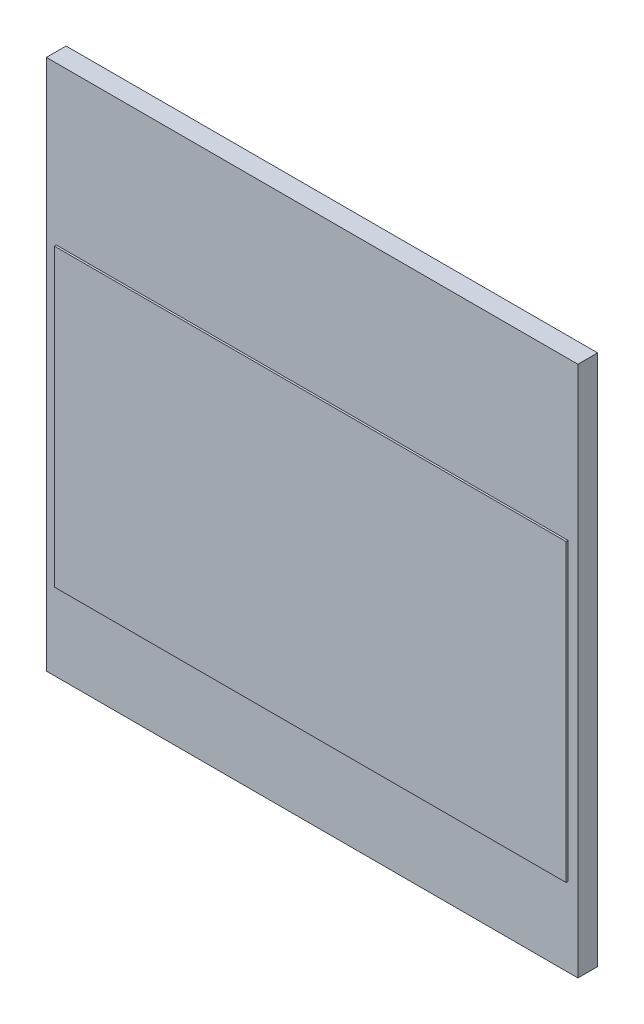
ISO-10303-21;
HEADER;
FILE_DESCRIPTION(('STEP AP214'),'2;1');
FILE_NAME('part.step','',(''),(''),'','','');
FILE_SCHEMA(('AUTOMOTIVE_DESIGN { 1 0 10303 214 1 1 1 1 }'));
ENDSEC;
DATA;
#1=APPLICATION_CONTEXT('core data for automotive mechanical design processes');
#2=APPLICATION_PROTOCOL_DEFINITION('international standard','automotive_design',2000,#1);
#3=PRODUCT_CONTEXT('',#1,'mechanical');
#4=PRODUCT('Part','Part','',(#3));
#5=PRODUCT_RELATED_PRODUCT_CATEGORY('part','',(#4));
#6=PRODUCT_DEFINITION_FORMATION('','',#4);
#7=PRODUCT_DEFINITION_CONTEXT('part definition',#1,'design');
#8=PRODUCT_DEFINITION('design','',#6,#7);
#9=PRODUCT_DEFINITION_SHAPE('','',#8);
#10=(LENGTH_UNIT() NAMED_UNIT(*) SI_UNIT(.MILLI.,.METRE.));
#11=(NAMED_UNIT(*) PLANE_ANGLE_UNIT() SI_UNIT($,.RADIAN.));
#12=(NAMED_UNIT(*) SI_UNIT($,.STERADIAN.) SOLID_ANGLE_UNIT());
#13=UNCERTAINTY_MEASURE_WITH_UNIT(LENGTH_MEASURE(1.E-05),#10,'distance_accuracy_value','');
#14=(GEOMETRIC_REPRESENTATION_CONTEXT(3) GLOBAL_UNCERTAINTY_ASSIGNED_CONTEXT((#13)) GLOBAL_UNIT_ASSIGNED_CONTEXT((#10,
#11,#12)) REPRESENTATION_CONTEXT('',''));
#15=CARTESIAN_POINT('',(0.,0.,0.));
#16=DIRECTION('',(0.,0.,1.));
#17=DIRECTION('',(1.,0.,0.));
#18=AXIS2_PLACEMENT_3D('',#15,#16,#17);
#19=CARTESIAN_POINT('',(13.,-7.5,0.1));
#20=DIRECTION('',(-1.,0.,0.));
#21=DIRECTION('',(0.,0.,1.));
#22=AXIS2_PLACEMENT_3D('',#19,#20,#21);
#23=PLANE('',#22);
#24=DIRECTION('',(0.,1.,0.));
#25=VECTOR('',#24,1.);
#26=CARTESIAN_POINT('',(13.,-7.5,0.));
#27=LINE('',#26,#25);
#28=CARTESIAN_POINT('',(13.,-7.5,0.));
#29=VERTEX_POINT('',#28);
#30=CARTESIAN_POINT('',(13.,7.5,0.));
#31=VERTEX_POINT('',#30);
#32=EDGE_CURVE('E117',#29,#31,#27,.T.);
#33=ORIENTED_EDGE('',*,*,#32,.T.);
#34=DIRECTION('',(0.,0.,-1.));
#35=VECTOR('',#34,1.);
#36=CARTESIAN_POINT('',(13.,7.5,0.1));
#37=LINE('',#36,#35);
#38=CARTESIAN_POINT('',(13.,7.5,0.1));
#39=VERTEX_POINT('',#38);
#40=EDGE_CURVE('E11',#39,#31,#37,.T.);
#41=ORIENTED_EDGE('',*,*,#40,.F.);
#42=DIRECTION('',(0.,1.,0.));
#43=VECTOR('',#42,1.);
#44=CARTESIAN_POINT('',(13.,-7.5,0.1));
#45=LINE('',#44,#43);
#46=CARTESIAN_POINT('',(13.,-7.5,0.1));
#47=VERTEX_POINT('',#46);
#48=EDGE_CURVE('E126',#47,#39,#45,.T.);
#49=ORIENTED_EDGE('',*,*,#48,.F.);
#50=DIRECTION('',(0.,0.,-1.));
#51=VECTOR('',#50,1.);
#52=CARTESIAN_POINT('',(13.,-7.5,0.1));
#53=LINE('',#52,#51);
#54=EDGE_CURVE('E133',#47,#29,#53,.T.);
#55=ORIENTED_EDGE('',*,*,#54,.T.);
#56=EDGE_LOOP('',(#33,#41,#49,#55));
#57=FACE_BOUND('',#56,.T.);
#58=ADVANCED_FACE('F32',(#57),#23,.F.);
#59=CARTESIAN_POINT('',(-13.,7.5,0.1));
#60=DIRECTION('',(0.,-1.,0.));
#61=DIRECTION('',(0.,0.,-1.));
#62=AXIS2_PLACEMENT_3D('',#59,#60,#61);
#63=PLANE('',#62);
#64=DIRECTION('',(-1.,0.,0.));
#65=VECTOR('',#64,1.);
#66=CARTESIAN_POINT('',(-13.,7.5,0.));
#67=LINE('',#66,#65);
#68=CARTESIAN_POINT('',(-13.,7.5,0.));
#69=VERTEX_POINT('',#68);
#70=EDGE_CURVE('E120',#31,#69,#67,.T.);
#71=ORIENTED_EDGE('',*,*,#70,.T.);
#72=DIRECTION('',(0.,0.,-1.));
#73=VECTOR('',#72,1.);
#74=CARTESIAN_POINT('',(-13.,7.5,0.1));
#75=LINE('',#74,#73);
#76=CARTESIAN_POINT('',(-13.,7.5,0.1));
#77=VERTEX_POINT('',#76);
#78=EDGE_CURVE('E40',#77,#69,#75,.T.);
#79=ORIENTED_EDGE('',*,*,#78,.F.);
#80=DIRECTION('',(-1.,0.,0.));
#81=VECTOR('',#80,1.);
#82=CARTESIAN_POINT('',(-13.,7.5,0.1));
#83=LINE('',#82,#81);
#84=EDGE_CURVE('E128',#39,#77,#83,.T.);
#85=ORIENTED_EDGE('',*,*,#84,.F.);
#86=ORIENTED_EDGE('',*,*,#40,.T.);
#87=EDGE_LOOP('',(#71,#79,#85,#86));
#88=FACE_BOUND('',#87,.T.);
#89=ADVANCED_FACE('F154',(#88),#63,.F.);
#90=CARTESIAN_POINT('',(-13.,-7.5,0.1));
#91=DIRECTION('',(1.,0.,0.));
#92=DIRECTION('',(0.,0.,-1.));
#93=AXIS2_PLACEMENT_3D('',#90,#91,#92);
#94=PLANE('',#93);
#95=DIRECTION('',(0.,-1.,0.));
#96=VECTOR('',#95,1.);
#97=CARTESIAN_POINT('',(-13.,-7.5,0.));
#98=LINE('',#97,#96);
#99=CARTESIAN_POINT('',(-13.,-7.5,0.));
#100=VERTEX_POINT('',#99);
#101=EDGE_CURVE('E137',#69,#100,#98,.T.);
#102=ORIENTED_EDGE('',*,*,#101,.T.);
#103=DIRECTION('',(0.,0.,-1.));
#104=VECTOR('',#103,1.);
#105=CARTESIAN_POINT('',(-13.,-7.5,0.1));
#106=LINE('',#105,#104);
#107=CARTESIAN_POINT('',(-13.,-7.5,0.1));
#108=VERTEX_POINT('',#107);
#109=EDGE_CURVE('E144',#108,#100,#106,.T.);
#110=ORIENTED_EDGE('',*,*,#109,.F.);
#111=DIRECTION('',(0.,-1.,0.));
#112=VECTOR('',#111,1.);
#113=CARTESIAN_POINT('',(-13.,-7.5,0.1));
#114=LINE('',#113,#112);
#115=EDGE_CURVE('E131',#77,#108,#114,.T.);
#116=ORIENTED_EDGE('',*,*,#115,.F.);
#117=ORIENTED_EDGE('',*,*,#78,.T.);
#118=EDGE_LOOP('',(#102,#110,#116,#117));
#119=FACE_BOUND('',#118,.T.);
#120=ADVANCED_FACE('F150',(#119),#94,.F.);
#121=CARTESIAN_POINT('',(-13.,-7.5,0.1));
#122=DIRECTION('',(0.,1.,0.));
#123=DIRECTION('',(0.,0.,1.));
#124=AXIS2_PLACEMENT_3D('',#121,#122,#123);
#125=PLANE('',#124);
#126=DIRECTION('',(1.,0.,0.));
#127=VECTOR('',#126,1.);
#128=CARTESIAN_POINT('',(-13.,-7.5,0.));
#129=LINE('',#128,#127);
#130=EDGE_CURVE('E129',#100,#29,#129,.T.);
#131=ORIENTED_EDGE('',*,*,#130,.T.);
#132=ORIENTED_EDGE('',*,*,#54,.F.);
#133=DIRECTION('',(1.,0.,0.));
#134=VECTOR('',#133,1.);
#135=CARTESIAN_POINT('',(-13.,-7.5,0.1));
#136=LINE('',#135,#134);
#137=EDGE_CURVE('E47',#108,#47,#136,.T.);
#138=ORIENTED_EDGE('',*,*,#137,.F.);
#139=ORIENTED_EDGE('',*,*,#109,.T.);
#140=EDGE_LOOP('',(#131,#132,#138,#139));
#141=FACE_BOUND('',#140,.T.);
#142=ADVANCED_FACE('F159',(#141),#125,.F.);
#143=CARTESIAN_POINT('',(0.,0.,0.1));
#144=DIRECTION('',(0.,0.,-1.));
#145=DIRECTION('',(-1.,0.,0.));
#146=AXIS2_PLACEMENT_3D('',#143,#144,#145);
#147=PLANE('',#146);
#148=ORIENTED_EDGE('',*,*,#48,.T.);
#149=ORIENTED_EDGE('',*,*,#84,.T.);
#150=ORIENTED_EDGE('',*,*,#115,.T.);
#151=ORIENTED_EDGE('',*,*,#137,.T.);
#152=EDGE_LOOP('',(#148,#149,#150,#151));
#153=FACE_BOUND('',#152,.T.);
#154=ADVANCED_FACE('F162',(#153),#147,.F.);
#155=CARTESIAN_POINT('',(0.,0.,0.));
#156=DIRECTION('',(0.,0.,1.));
#157=DIRECTION('',(1.,0.,0.));
#158=AXIS2_PLACEMENT_3D('',#155,#156,#157);
#159=PLANE('',#158);
#160=DIRECTION('',(0.,1.,0.));
#161=VECTOR('',#160,1.);
#162=CARTESIAN_POINT('',(-13.5,-11.5,0.));
#163=LINE('',#162,#161);
#164=CARTESIAN_POINT('',(-13.5,-11.5,0.));
#165=VERTEX_POINT('',#164);
#166=CARTESIAN_POINT('',(-13.5,15.5,0.));
#167=VERTEX_POINT('',#166);
#168=EDGE_CURVE('E116',#165,#167,#163,.T.);
#169=ORIENTED_EDGE('',*,*,#168,.F.);
#170=DIRECTION('',(-1.,0.,0.));
#171=VECTOR('',#170,1.);
#172=CARTESIAN_POINT('',(13.5,-11.5,0.));
#173=LINE('',#172,#171);
#174=CARTESIAN_POINT('',(13.5,-11.5,0.));
#175=VERTEX_POINT('',#174);
#176=EDGE_CURVE('E112',#175,#165,#173,.T.);
#177=ORIENTED_EDGE('',*,*,#176,.F.);
#178=DIRECTION('',(0.,-1.,0.));
#179=VECTOR('',#178,1.);
#180=CARTESIAN_POINT('',(13.5,-11.5,0.));
#181=LINE('',#180,#179);
#182=CARTESIAN_POINT('',(13.5,15.5,0.));
#183=VERTEX_POINT('',#182);
#184=EDGE_CURVE('E246',#183,#175,#181,.T.);
#185=ORIENTED_EDGE('',*,*,#184,.F.);
#186=DIRECTION('',(1.,0.,0.));
#187=VECTOR('',#186,1.);
#188=CARTESIAN_POINT('',(13.5,15.5,0.));
#189=LINE('',#188,#187);
#190=EDGE_CURVE('E249',#167,#183,#189,.T.);
#191=ORIENTED_EDGE('',*,*,#190,.F.);
#192=EDGE_LOOP('',(#169,#177,#185,#191));
#193=FACE_BOUND('',#192,.T.);
#194=ORIENTED_EDGE('',*,*,#32,.F.);
#195=ORIENTED_EDGE('',*,*,#130,.F.);
#196=ORIENTED_EDGE('',*,*,#101,.F.);
#197=ORIENTED_EDGE('',*,*,#70,.F.);
#198=EDGE_LOOP('',(#194,#195,#196,#197));
#199=FACE_BOUND('',#198,.T.);
#200=ADVANCED_FACE('F157',(#193,#199),#159,.T.);
#201=CARTESIAN_POINT('',(-13.5,-11.5,-1.));
#202=DIRECTION('',(1.,0.,0.));
#203=DIRECTION('',(0.,0.,-1.));
#204=AXIS2_PLACEMENT_3D('',#201,#202,#203);
#205=PLANE('',#204);
#206=ORIENTED_EDGE('',*,*,#168,.T.);
#207=DIRECTION('',(0.,0.,1.));
#208=VECTOR('',#207,1.);
#209=CARTESIAN_POINT('',(-13.5,15.5,-1.));
#210=LINE('',#209,#208);
#211=CARTESIAN_POINT('',(-13.5,15.5,-1.));
#212=VERTEX_POINT('',#211);
#213=EDGE_CURVE('E96',#212,#167,#210,.T.);
#214=ORIENTED_EDGE('',*,*,#213,.F.);
#215=DIRECTION('',(0.,1.,0.));
#216=VECTOR('',#215,1.);
#217=CARTESIAN_POINT('',(-13.5,-11.5,-1.));
#218=LINE('',#217,#216);
#219=CARTESIAN_POINT('',(-13.5,-11.5,-1.));
#220=VERTEX_POINT('',#219);
#221=EDGE_CURVE('E103',#220,#212,#218,.T.);
#222=ORIENTED_EDGE('',*,*,#221,.F.);
#223=DIRECTION('',(0.,0.,1.));
#224=VECTOR('',#223,1.);
#225=CARTESIAN_POINT('',(-13.5,-11.5,-1.));
#226=LINE('',#225,#224);
#227=EDGE_CURVE('E243',#220,#165,#226,.T.);
#228=ORIENTED_EDGE('',*,*,#227,.T.);
#229=EDGE_LOOP('',(#206,#214,#222,#228));
#230=FACE_BOUND('',#229,.T.);
#231=ADVANCED_FACE('F114',(#230),#205,.F.);
#232=CARTESIAN_POINT('',(13.5,15.5,-1.));
#233=DIRECTION('',(0.,-1.,0.));
#234=DIRECTION('',(0.,0.,-1.));
#235=AXIS2_PLACEMENT_3D('',#232,#233,#234);
#236=PLANE('',#235);
#237=ORIENTED_EDGE('',*,*,#190,.T.);
#238=DIRECTION('',(0.,0.,1.));
#239=VECTOR('',#238,1.);
#240=CARTESIAN_POINT('',(13.5,15.5,-1.));
#241=LINE('',#240,#239);
#242=CARTESIAN_POINT('',(13.5,15.5,-1.));
#243=VERTEX_POINT('',#242);
#244=EDGE_CURVE('E99',#243,#183,#241,.T.);
#245=ORIENTED_EDGE('',*,*,#244,.F.);
#246=DIRECTION('',(1.,0.,0.));
#247=VECTOR('',#246,1.);
#248=CARTESIAN_POINT('',(13.5,15.5,-1.));
#249=LINE('',#248,#247);
#250=EDGE_CURVE('E92',#212,#243,#249,.T.);
#251=ORIENTED_EDGE('',*,*,#250,.F.);
#252=ORIENTED_EDGE('',*,*,#213,.T.);
#253=EDGE_LOOP('',(#237,#245,#251,#252));
#254=FACE_BOUND('',#253,.T.);
#255=ADVANCED_FACE('F94',(#254),#236,.F.);
#256=CARTESIAN_POINT('',(13.5,-11.5,-1.));
#257=DIRECTION('',(-1.,0.,0.));
#258=DIRECTION('',(0.,0.,1.));
#259=AXIS2_PLACEMENT_3D('',#256,#257,#258);
#260=PLANE('',#259);
#261=ORIENTED_EDGE('',*,*,#184,.T.);
#262=DIRECTION('',(0.,0.,1.));
#263=VECTOR('',#262,1.);
#264=CARTESIAN_POINT('',(13.5,-11.5,-1.));
#265=LINE('',#264,#263);
#266=CARTESIAN_POINT('',(13.5,-11.5,-1.));
#267=VERTEX_POINT('',#266);
#268=EDGE_CURVE('E122',#267,#175,#265,.T.);
#269=ORIENTED_EDGE('',*,*,#268,.F.);
#270=DIRECTION('',(0.,-1.,0.));
#271=VECTOR('',#270,1.);
#272=CARTESIAN_POINT('',(13.5,-11.5,-1.));
#273=LINE('',#272,#271);
#274=EDGE_CURVE('E102',#243,#267,#273,.T.);
#275=ORIENTED_EDGE('',*,*,#274,.F.);
#276=ORIENTED_EDGE('',*,*,#244,.T.);
#277=EDGE_LOOP('',(#261,#269,#275,#276));
#278=FACE_BOUND('',#277,.T.);
#279=ADVANCED_FACE('F210',(#278),#260,.F.);
#280=CARTESIAN_POINT('',(13.5,-11.5,-1.));
#281=DIRECTION('',(0.,1.,0.));
#282=DIRECTION('',(0.,0.,1.));
#283=AXIS2_PLACEMENT_3D('',#280,#281,#282);
#284=PLANE('',#283);
#285=ORIENTED_EDGE('',*,*,#176,.T.);
#286=ORIENTED_EDGE('',*,*,#227,.F.);
#287=DIRECTION('',(-1.,0.,0.));
#288=VECTOR('',#287,1.);
#289=CARTESIAN_POINT('',(13.5,-11.5,-1.));
#290=LINE('',#289,#288);
#291=EDGE_CURVE('E108',#267,#220,#290,.T.);
#292=ORIENTED_EDGE('',*,*,#291,.F.);
#293=ORIENTED_EDGE('',*,*,#268,.T.);
#294=EDGE_LOOP('',(#285,#286,#292,#293));
#295=FACE_BOUND('',#294,.T.);
#296=ADVANCED_FACE('F219',(#295),#284,.F.);
#297=CARTESIAN_POINT('',(0.,0.,-1.));
#298=DIRECTION('',(0.,0.,1.));
#299=DIRECTION('',(1.,0.,0.));
#300=AXIS2_PLACEMENT_3D('',#297,#298,#299);
#301=PLANE('',#300);
#302=ORIENTED_EDGE('',*,*,#221,.T.);
#303=ORIENTED_EDGE('',*,*,#250,.T.);
#304=ORIENTED_EDGE('',*,*,#274,.T.);
#305=ORIENTED_EDGE('',*,*,#291,.T.);
#306=EDGE_LOOP('',(#302,#303,#304,#305));
#307=FACE_BOUND('',#306,.T.);
#308=ADVANCED_FACE('F106',(#307),#301,.F.);
#309=CLOSED_SHELL('',(#58,#89,#120,#142,#154,#200,#231,#255,#279,#296,#308));
#310=MANIFOLD_SOLID_BREP('B2',#309);
#311=ADVANCED_BREP_SHAPE_REPRESENTATION('',(#18,#310),#14);
#312=SHAPE_DEFINITION_REPRESENTATION(#9,#311);
ENDSEC;
END-ISO-10303-21;
